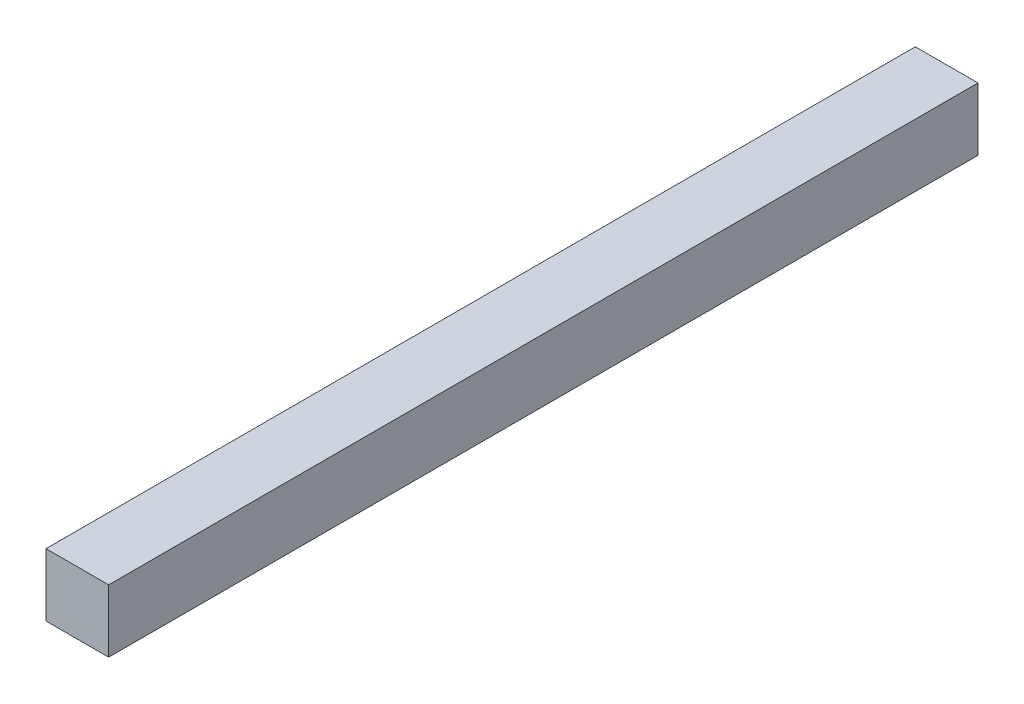
ISO-10303-21;
HEADER;
FILE_DESCRIPTION(('STEP AP214'),'2;1');
FILE_NAME('part.step','',(''),(''),'','','');
FILE_SCHEMA(('AUTOMOTIVE_DESIGN { 1 0 10303 214 1 1 1 1 }'));
ENDSEC;
DATA;
#1=APPLICATION_CONTEXT('core data for automotive mechanical design processes');
#2=APPLICATION_PROTOCOL_DEFINITION('international standard','automotive_design',2000,#1);
#3=PRODUCT_CONTEXT('',#1,'mechanical');
#4=PRODUCT('Part','Part','',(#3));
#5=PRODUCT_RELATED_PRODUCT_CATEGORY('part','',(#4));
#6=PRODUCT_DEFINITION_FORMATION('','',#4);
#7=PRODUCT_DEFINITION_CONTEXT('part definition',#1,'design');
#8=PRODUCT_DEFINITION('design','',#6,#7);
#9=PRODUCT_DEFINITION_SHAPE('','',#8);
#10=(LENGTH_UNIT() NAMED_UNIT(*) SI_UNIT(.MILLI.,.METRE.));
#11=(NAMED_UNIT(*) PLANE_ANGLE_UNIT() SI_UNIT($,.RADIAN.));
#12=(NAMED_UNIT(*) SI_UNIT($,.STERADIAN.) SOLID_ANGLE_UNIT());
#13=UNCERTAINTY_MEASURE_WITH_UNIT(LENGTH_MEASURE(1.E-05),#10,'distance_accuracy_value','');
#14=(GEOMETRIC_REPRESENTATION_CONTEXT(3) GLOBAL_UNCERTAINTY_ASSIGNED_CONTEXT((#13)) GLOBAL_UNIT_ASSIGNED_CONTEXT((#10,
#11,#12)) REPRESENTATION_CONTEXT('',''));
#15=CARTESIAN_POINT('',(0.,0.,0.));
#16=DIRECTION('',(0.,0.,1.));
#17=DIRECTION('',(1.,0.,0.));
#18=AXIS2_PLACEMENT_3D('',#15,#16,#17);
#19=CARTESIAN_POINT('',(0.,0.,860.));
#20=DIRECTION('',(1.,0.,0.));
#21=DIRECTION('',(0.,0.,-1.));
#22=AXIS2_PLACEMENT_3D('',#19,#20,#21);
#23=PLANE('',#22);
#24=DIRECTION('',(0.,-1.,0.));
#25=VECTOR('',#24,1.);
#26=CARTESIAN_POINT('',(0.,0.,0.));
#27=LINE('',#26,#25);
#28=CARTESIAN_POINT('',(0.,62.,0.));
#29=VERTEX_POINT('',#28);
#30=CARTESIAN_POINT('',(0.,0.,0.));
#31=VERTEX_POINT('',#30);
#32=EDGE_CURVE('E96',#29,#31,#27,.T.);
#33=ORIENTED_EDGE('',*,*,#32,.T.);
#34=DIRECTION('',(0.,0.,-1.));
#35=VECTOR('',#34,1.);
#36=CARTESIAN_POINT('',(0.,0.,860.));
#37=LINE('',#36,#35);
#38=CARTESIAN_POINT('',(0.,0.,860.));
#39=VERTEX_POINT('',#38);
#40=EDGE_CURVE('E11',#39,#31,#37,.T.);
#41=ORIENTED_EDGE('',*,*,#40,.F.);
#42=DIRECTION('',(0.,-1.,0.));
#43=VECTOR('',#42,1.);
#44=CARTESIAN_POINT('',(0.,0.,860.));
#45=LINE('',#44,#43);
#46=CARTESIAN_POINT('',(0.,62.,860.));
#47=VERTEX_POINT('',#46);
#48=EDGE_CURVE('E84',#47,#39,#45,.T.);
#49=ORIENTED_EDGE('',*,*,#48,.F.);
#50=DIRECTION('',(0.,0.,-1.));
#51=VECTOR('',#50,1.);
#52=CARTESIAN_POINT('',(0.,62.,860.));
#53=LINE('',#52,#51);
#54=EDGE_CURVE('E92',#47,#29,#53,.T.);
#55=ORIENTED_EDGE('',*,*,#54,.T.);
#56=EDGE_LOOP('',(#33,#41,#49,#55));
#57=FACE_BOUND('',#56,.T.);
#58=ADVANCED_FACE('F33',(#57),#23,.F.);
#59=CARTESIAN_POINT('',(0.,0.,860.));
#60=DIRECTION('',(0.,1.,0.));
#61=DIRECTION('',(0.,0.,1.));
#62=AXIS2_PLACEMENT_3D('',#59,#60,#61);
#63=PLANE('',#62);
#64=DIRECTION('',(1.,0.,0.));
#65=VECTOR('',#64,1.);
#66=CARTESIAN_POINT('',(0.,0.,0.));
#67=LINE('',#66,#65);
#68=CARTESIAN_POINT('',(62.,0.,0.));
#69=VERTEX_POINT('',#68);
#70=EDGE_CURVE('E88',#31,#69,#67,.T.);
#71=ORIENTED_EDGE('',*,*,#70,.T.);
#72=DIRECTION('',(0.,0.,-1.));
#73=VECTOR('',#72,1.);
#74=CARTESIAN_POINT('',(62.,0.,860.));
#75=LINE('',#74,#73);
#76=CARTESIAN_POINT('',(62.,0.,860.));
#77=VERTEX_POINT('',#76);
#78=EDGE_CURVE('E41',#77,#69,#75,.T.);
#79=ORIENTED_EDGE('',*,*,#78,.F.);
#80=DIRECTION('',(1.,0.,0.));
#81=VECTOR('',#80,1.);
#82=CARTESIAN_POINT('',(0.,0.,860.));
#83=LINE('',#82,#81);
#84=EDGE_CURVE('E79',#39,#77,#83,.T.);
#85=ORIENTED_EDGE('',*,*,#84,.F.);
#86=ORIENTED_EDGE('',*,*,#40,.T.);
#87=EDGE_LOOP('',(#71,#79,#85,#86));
#88=FACE_BOUND('',#87,.T.);
#89=ADVANCED_FACE('F87',(#88),#63,.F.);
#90=CARTESIAN_POINT('',(62.,0.,860.));
#91=DIRECTION('',(-1.,0.,0.));
#92=DIRECTION('',(0.,0.,1.));
#93=AXIS2_PLACEMENT_3D('',#90,#91,#92);
#94=PLANE('',#93);
#95=DIRECTION('',(0.,1.,0.));
#96=VECTOR('',#95,1.);
#97=CARTESIAN_POINT('',(62.,0.,0.));
#98=LINE('',#97,#96);
#99=CARTESIAN_POINT('',(62.,62.,0.));
#100=VERTEX_POINT('',#99);
#101=EDGE_CURVE('E66',#69,#100,#98,.T.);
#102=ORIENTED_EDGE('',*,*,#101,.T.);
#103=DIRECTION('',(0.,0.,-1.));
#104=VECTOR('',#103,1.);
#105=CARTESIAN_POINT('',(62.,62.,860.));
#106=LINE('',#105,#104);
#107=CARTESIAN_POINT('',(62.,62.,860.));
#108=VERTEX_POINT('',#107);
#109=EDGE_CURVE('E89',#108,#100,#106,.T.);
#110=ORIENTED_EDGE('',*,*,#109,.F.);
#111=DIRECTION('',(0.,1.,0.));
#112=VECTOR('',#111,1.);
#113=CARTESIAN_POINT('',(62.,0.,860.));
#114=LINE('',#113,#112);
#115=EDGE_CURVE('E82',#77,#108,#114,.T.);
#116=ORIENTED_EDGE('',*,*,#115,.F.);
#117=ORIENTED_EDGE('',*,*,#78,.T.);
#118=EDGE_LOOP('',(#102,#110,#116,#117));
#119=FACE_BOUND('',#118,.T.);
#120=ADVANCED_FACE('F90',(#119),#94,.F.);
#121=CARTESIAN_POINT('',(0.,62.,860.));
#122=DIRECTION('',(0.,-1.,0.));
#123=DIRECTION('',(0.,0.,-1.));
#124=AXIS2_PLACEMENT_3D('',#121,#122,#123);
#125=PLANE('',#124);
#126=DIRECTION('',(-1.,0.,0.));
#127=VECTOR('',#126,1.);
#128=CARTESIAN_POINT('',(0.,62.,0.));
#129=LINE('',#128,#127);
#130=EDGE_CURVE('E72',#100,#29,#129,.T.);
#131=ORIENTED_EDGE('',*,*,#130,.T.);
#132=ORIENTED_EDGE('',*,*,#54,.F.);
#133=DIRECTION('',(-1.,0.,0.));
#134=VECTOR('',#133,1.);
#135=CARTESIAN_POINT('',(0.,62.,860.));
#136=LINE('',#135,#134);
#137=EDGE_CURVE('E49',#108,#47,#136,.T.);
#138=ORIENTED_EDGE('',*,*,#137,.F.);
#139=ORIENTED_EDGE('',*,*,#109,.T.);
#140=EDGE_LOOP('',(#131,#132,#138,#139));
#141=FACE_BOUND('',#140,.T.);
#142=ADVANCED_FACE('F104',(#141),#125,.F.);
#143=CARTESIAN_POINT('',(0.,0.,860.));
#144=DIRECTION('',(0.,0.,-1.));
#145=DIRECTION('',(-1.,0.,0.));
#146=AXIS2_PLACEMENT_3D('',#143,#144,#145);
#147=PLANE('',#146);
#148=ORIENTED_EDGE('',*,*,#48,.T.);
#149=ORIENTED_EDGE('',*,*,#84,.T.);
#150=ORIENTED_EDGE('',*,*,#115,.T.);
#151=ORIENTED_EDGE('',*,*,#137,.T.);
#152=EDGE_LOOP('',(#148,#149,#150,#151));
#153=FACE_BOUND('',#152,.T.);
#154=ADVANCED_FACE('F80',(#153),#147,.F.);
#155=CARTESIAN_POINT('',(0.,0.,0.));
#156=DIRECTION('',(0.,0.,-1.));
#157=DIRECTION('',(-1.,0.,0.));
#158=AXIS2_PLACEMENT_3D('',#155,#156,#157);
#159=PLANE('',#158);
#160=CARTESIAN_POINT('',(31.,31.,0.));
#161=DIRECTION('',(0.,0.,1.));
#162=DIRECTION('',(1.,0.,0.));
#163=AXIS2_PLACEMENT_3D('',#160,#161,#162);
#164=CIRCLE('',#163,6.);
#165=CARTESIAN_POINT('',(37.,31.,0.));
#166=VERTEX_POINT('',#165);
#167=EDGE_CURVE('E110',#166,#166,#164,.T.);
#168=ORIENTED_EDGE('',*,*,#167,.T.);
#169=EDGE_LOOP('',(#168));
#170=FACE_BOUND('',#169,.T.);
#171=ORIENTED_EDGE('',*,*,#32,.F.);
#172=ORIENTED_EDGE('',*,*,#130,.F.);
#173=ORIENTED_EDGE('',*,*,#101,.F.);
#174=ORIENTED_EDGE('',*,*,#70,.F.);
#175=EDGE_LOOP('',(#171,#172,#173,#174));
#176=FACE_BOUND('',#175,.T.);
#177=ADVANCED_FACE('F107',(#170,#176),#159,.T.);
#178=CARTESIAN_POINT('',(31.,31.,80.));
#179=DIRECTION('',(0.,0.,-1.));
#180=DIRECTION('',(-1.,0.,0.));
#181=AXIS2_PLACEMENT_3D('',#178,#179,#180);
#182=CYLINDRICAL_SURFACE('',#181,6.);
#183=CARTESIAN_POINT('',(31.,31.,80.));
#184=DIRECTION('',(0.,0.,1.));
#185=DIRECTION('',(1.,0.,0.));
#186=AXIS2_PLACEMENT_3D('',#183,#184,#185);
#187=CIRCLE('',#186,6.);
#188=CARTESIAN_POINT('',(37.,31.,80.));
#189=VERTEX_POINT('',#188);
#190=EDGE_CURVE('E99',#189,#189,#187,.T.);
#191=ORIENTED_EDGE('',*,*,#190,.T.);
#192=EDGE_LOOP('',(#191));
#193=FACE_BOUND('',#192,.T.);
#194=ORIENTED_EDGE('',*,*,#167,.F.);
#195=EDGE_LOOP('',(#194));
#196=FACE_BOUND('',#195,.T.);
#197=ADVANCED_FACE('F116',(#193,#196),#182,.F.);
#198=CARTESIAN_POINT('',(31.,31.,80.));
#199=DIRECTION('',(0.,0.,1.));
#200=DIRECTION('',(1.,0.,0.));
#201=AXIS2_PLACEMENT_3D('',#198,#199,#200);
#202=PLANE('',#201);
#203=ORIENTED_EDGE('',*,*,#190,.F.);
#204=EDGE_LOOP('',(#203));
#205=FACE_BOUND('',#204,.T.);
#206=ADVANCED_FACE('F119',(#205),#202,.F.);
#207=CLOSED_SHELL('',(#58,#89,#120,#142,#154,#177,#197,#206));
#208=MANIFOLD_SOLID_BREP('B2',#207);
#209=ADVANCED_BREP_SHAPE_REPRESENTATION('',(#18,#208),#14);
#210=SHAPE_DEFINITION_REPRESENTATION(#9,#209);
ENDSEC;
END-ISO-10303-21;
